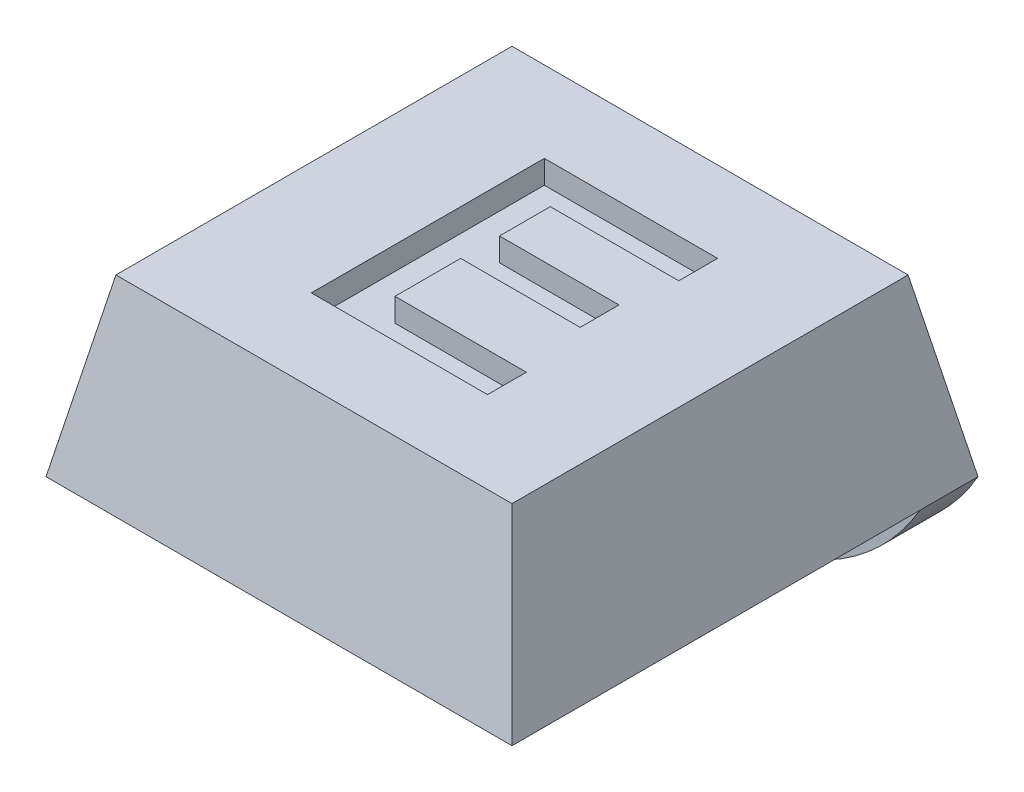
ISO-10303-21;
HEADER;
FILE_DESCRIPTION(('STEP AP214'),'2;1');
FILE_NAME('part.step','',(''),(''),'','','');
FILE_SCHEMA(('AUTOMOTIVE_DESIGN { 1 0 10303 214 1 1 1 1 }'));
ENDSEC;
DATA;
#1=APPLICATION_CONTEXT('core data for automotive mechanical design processes');
#2=APPLICATION_PROTOCOL_DEFINITION('international standard','automotive_design',2000,#1);
#3=PRODUCT_CONTEXT('',#1,'mechanical');
#4=PRODUCT('Part','Part','',(#3));
#5=PRODUCT_RELATED_PRODUCT_CATEGORY('part','',(#4));
#6=PRODUCT_DEFINITION_FORMATION('','',#4);
#7=PRODUCT_DEFINITION_CONTEXT('part definition',#1,'design');
#8=PRODUCT_DEFINITION('design','',#6,#7);
#9=PRODUCT_DEFINITION_SHAPE('','',#8);
#10=(LENGTH_UNIT() NAMED_UNIT(*) SI_UNIT(.MILLI.,.METRE.));
#11=(NAMED_UNIT(*) PLANE_ANGLE_UNIT() SI_UNIT($,.RADIAN.));
#12=(NAMED_UNIT(*) SI_UNIT($,.STERADIAN.) SOLID_ANGLE_UNIT());
#13=UNCERTAINTY_MEASURE_WITH_UNIT(LENGTH_MEASURE(1.E-05),#10,'distance_accuracy_value','');
#14=(GEOMETRIC_REPRESENTATION_CONTEXT(3) GLOBAL_UNCERTAINTY_ASSIGNED_CONTEXT((#13)) GLOBAL_UNIT_ASSIGNED_CONTEXT((#10,
#11,#12)) REPRESENTATION_CONTEXT('',''));
#15=CARTESIAN_POINT('',(0.,0.,0.));
#16=DIRECTION('',(0.,0.,1.));
#17=DIRECTION('',(1.,0.,0.));
#18=AXIS2_PLACEMENT_3D('',#15,#16,#17);
#19=CARTESIAN_POINT('',(0.,3.,0.));
#20=DIRECTION('',(0.,-1.,0.));
#21=DIRECTION('',(0.,0.,-1.));
#22=AXIS2_PLACEMENT_3D('',#19,#20,#21);
#23=PLANE('',#22);
#24=DIRECTION('',(-1.,0.,0.));
#25=VECTOR('',#24,1.);
#26=CARTESIAN_POINT('',(11.,3.,-0.6));
#27=LINE('',#26,#25);
#28=CARTESIAN_POINT('',(7.4,3.,-0.6));
#29=VERTEX_POINT('',#28);
#30=CARTESIAN_POINT('',(0.6,3.,-0.6));
#31=VERTEX_POINT('',#30);
#32=EDGE_CURVE('E229',#29,#31,#27,.T.);
#33=ORIENTED_EDGE('',*,*,#32,.F.);
#34=DIRECTION('',(0.,0.,1.));
#35=VECTOR('',#34,1.);
#36=CARTESIAN_POINT('',(7.4,3.,-8.));
#37=LINE('',#36,#35);
#38=CARTESIAN_POINT('',(7.4,3.,-7.4));
#39=VERTEX_POINT('',#38);
#40=EDGE_CURVE('E242',#39,#29,#37,.T.);
#41=ORIENTED_EDGE('',*,*,#40,.F.);
#42=DIRECTION('',(-1.,0.,0.));
#43=VECTOR('',#42,1.);
#44=CARTESIAN_POINT('',(11.,3.,-7.4));
#45=LINE('',#44,#43);
#46=CARTESIAN_POINT('',(0.599999999999999,3.,-7.4));
#47=VERTEX_POINT('',#46);
#48=EDGE_CURVE('E225',#39,#47,#45,.T.);
#49=ORIENTED_EDGE('',*,*,#48,.T.);
#50=DIRECTION('',(0.,0.,1.));
#51=VECTOR('',#50,1.);
#52=CARTESIAN_POINT('',(0.6,3.,-8.));
#53=LINE('',#52,#51);
#54=EDGE_CURVE('E245',#47,#31,#53,.T.);
#55=ORIENTED_EDGE('',*,*,#54,.T.);
#56=EDGE_LOOP('',(#33,#41,#49,#55));
#57=FACE_BOUND('',#56,.T.);
#58=DIRECTION('',(-1.,0.,0.));
#59=VECTOR('',#58,1.);
#60=CARTESIAN_POINT('',(5.56986613117245,3.,-2.0105672247147));
#61=LINE('',#60,#59);
#62=CARTESIAN_POINT('',(5.56986613117245,3.,-2.0105672247147));
#63=VERTEX_POINT('',#62);
#64=CARTESIAN_POINT('',(2.54422510553142,3.,-2.0105672247147));
#65=VERTEX_POINT('',#64);
#66=EDGE_CURVE('E58',#63,#65,#61,.T.);
#67=ORIENTED_EDGE('',*,*,#66,.T.);
#68=DIRECTION('',(0.,0.,-1.));
#69=VECTOR('',#68,1.);
#70=CARTESIAN_POINT('',(2.54422510553142,3.,-2.0105672247147));
#71=LINE('',#70,#69);
#72=CARTESIAN_POINT('',(2.54422510553142,3.,-6.0105672247147));
#73=VERTEX_POINT('',#72);
#74=EDGE_CURVE('E197',#65,#73,#71,.T.);
#75=ORIENTED_EDGE('',*,*,#74,.T.);
#76=DIRECTION('',(1.,0.,0.));
#77=VECTOR('',#76,1.);
#78=CARTESIAN_POINT('',(2.54422510553142,3.,-6.0105672247147));
#79=LINE('',#78,#77);
#80=CARTESIAN_POINT('',(5.5185840798904,3.,-6.0105672247147));
#81=VERTEX_POINT('',#80);
#82=EDGE_CURVE('E666',#73,#81,#79,.T.);
#83=ORIENTED_EDGE('',*,*,#82,.T.);
#84=DIRECTION('',(0.,0.,1.));
#85=VECTOR('',#84,1.);
#86=CARTESIAN_POINT('',(5.5185840798904,3.,-6.0105672247147));
#87=LINE('',#86,#85);
#88=CARTESIAN_POINT('',(5.5185840798904,3.,-5.34390055804804));
#89=VERTEX_POINT('',#88);
#90=EDGE_CURVE('E668',#81,#89,#87,.T.);
#91=ORIENTED_EDGE('',*,*,#90,.T.);
#92=DIRECTION('',(-1.,0.,0.));
#93=VECTOR('',#92,1.);
#94=CARTESIAN_POINT('',(5.5185840798904,3.,-5.34390055804804));
#95=LINE('',#94,#93);
#96=CARTESIAN_POINT('',(3.31345587476219,3.,-5.34390055804804));
#97=VERTEX_POINT('',#96);
#98=EDGE_CURVE('E673',#89,#97,#95,.T.);
#99=ORIENTED_EDGE('',*,*,#98,.T.);
#100=DIRECTION('',(0.,0.,1.));
#101=VECTOR('',#100,1.);
#102=CARTESIAN_POINT('',(3.31345587476219,3.,-5.34390055804804));
#103=LINE('',#102,#101);
#104=CARTESIAN_POINT('',(3.31345587476219,3.,-4.47210568625316));
#105=VERTEX_POINT('',#104);
#106=EDGE_CURVE('E683',#97,#105,#103,.T.);
#107=ORIENTED_EDGE('',*,*,#106,.T.);
#108=DIRECTION('',(1.,0.,0.));
#109=VECTOR('',#108,1.);
#110=CARTESIAN_POINT('',(3.31345587476219,3.,-4.47210568625316));
#111=LINE('',#110,#109);
#112=CARTESIAN_POINT('',(5.36473792604425,3.,-4.47210568625316));
#113=VERTEX_POINT('',#112);
#114=EDGE_CURVE('E687',#105,#113,#111,.T.);
#115=ORIENTED_EDGE('',*,*,#114,.T.);
#116=DIRECTION('',(0.,0.,1.));
#117=VECTOR('',#116,1.);
#118=CARTESIAN_POINT('',(5.36473792604425,3.,-4.47210568625316));
#119=LINE('',#118,#117);
#120=CARTESIAN_POINT('',(5.36473792604425,3.,-3.8054390195865));
#121=VERTEX_POINT('',#120);
#122=EDGE_CURVE('E691',#113,#121,#119,.T.);
#123=ORIENTED_EDGE('',*,*,#122,.T.);
#124=DIRECTION('',(-1.,0.,0.));
#125=VECTOR('',#124,1.);
#126=CARTESIAN_POINT('',(5.36473792604425,3.,-3.8054390195865));
#127=LINE('',#126,#125);
#128=CARTESIAN_POINT('',(3.31345587476219,3.,-3.8054390195865));
#129=VERTEX_POINT('',#128);
#130=EDGE_CURVE('E632',#121,#129,#127,.T.);
#131=ORIENTED_EDGE('',*,*,#130,.T.);
#132=DIRECTION('',(0.,0.,1.));
#133=VECTOR('',#132,1.);
#134=CARTESIAN_POINT('',(3.31345587476219,3.,-3.8054390195865));
#135=LINE('',#134,#133);
#136=CARTESIAN_POINT('',(3.31345587476219,3.,-2.67723389138137));
#137=VERTEX_POINT('',#136);
#138=EDGE_CURVE('E627',#129,#137,#135,.T.);
#139=ORIENTED_EDGE('',*,*,#138,.T.);
#140=DIRECTION('',(1.,0.,0.));
#141=VECTOR('',#140,1.);
#142=CARTESIAN_POINT('',(3.31345587476219,3.,-2.67723389138137));
#143=LINE('',#142,#141);
#144=CARTESIAN_POINT('',(5.56986613117245,3.,-2.67723389138137));
#145=VERTEX_POINT('',#144);
#146=EDGE_CURVE('E621',#137,#145,#143,.T.);
#147=ORIENTED_EDGE('',*,*,#146,.T.);
#148=DIRECTION('',(0.,0.,1.));
#149=VECTOR('',#148,1.);
#150=CARTESIAN_POINT('',(5.56986613117245,3.,-2.67723389138137));
#151=LINE('',#150,#149);
#152=EDGE_CURVE('E193',#145,#63,#151,.T.);
#153=ORIENTED_EDGE('',*,*,#152,.T.);
#154=EDGE_LOOP('',(#67,#75,#83,#91,#99,#107,#115,#123,#131,#139,#147,#153));
#155=FACE_BOUND('',#154,.T.);
#156=ADVANCED_FACE('F42',(#57,#155),#23,.F.);
#157=CARTESIAN_POINT('',(8.,0.,-8.));
#158=DIRECTION('',(-0.98058067569092,-0.196116135138184,0.));
#159=DIRECTION('',(0.196116135138184,-0.98058067569092,0.));
#160=AXIS2_PLACEMENT_3D('',#157,#158,#159);
#161=PLANE('',#160);
#162=DIRECTION('',(-0.192450089729875,0.962250448649376,-0.192450089729875));
#163=VECTOR('',#162,1.);
#164=CARTESIAN_POINT('',(7.7037037037037,1.48148148148148,-0.296296296296296));
#165=LINE('',#164,#163);
#166=CARTESIAN_POINT('',(8.,0.,0.));
#167=VERTEX_POINT('',#166);
#168=EDGE_CURVE('E239',#167,#29,#165,.T.);
#169=ORIENTED_EDGE('',*,*,#168,.F.);
#170=DIRECTION('',(0.,0.,-1.));
#171=VECTOR('',#170,1.);
#172=CARTESIAN_POINT('',(8.,0.,0.));
#173=LINE('',#172,#171);
#174=CARTESIAN_POINT('',(8.,0.,-7.));
#175=VERTEX_POINT('',#174);
#176=EDGE_CURVE('E258',#167,#175,#173,.T.);
#177=ORIENTED_EDGE('',*,*,#176,.T.);
#178=DIRECTION('',(0.,0.,1.));
#179=VECTOR('',#178,1.);
#180=CARTESIAN_POINT('',(8.,0.,-8.));
#181=LINE('',#180,#179);
#182=CARTESIAN_POINT('',(8.,0.,-8.));
#183=VERTEX_POINT('',#182);
#184=EDGE_CURVE('E199',#183,#175,#181,.T.);
#185=ORIENTED_EDGE('',*,*,#184,.F.);
#186=DIRECTION('',(0.192450089729875,-0.962250448649376,-0.192450089729875));
#187=VECTOR('',#186,1.);
#188=CARTESIAN_POINT('',(8.,0.,-8.));
#189=LINE('',#188,#187);
#190=EDGE_CURVE('E232',#39,#183,#189,.T.);
#191=ORIENTED_EDGE('',*,*,#190,.F.);
#192=ORIENTED_EDGE('',*,*,#40,.T.);
#193=EDGE_LOOP('',(#169,#177,#185,#191,#192));
#194=FACE_BOUND('',#193,.T.);
#195=ADVANCED_FACE('F326',(#194),#161,.F.);
#196=CARTESIAN_POINT('',(0.,0.,-8.));
#197=DIRECTION('',(0.98058067569092,-0.196116135138184,0.));
#198=DIRECTION('',(0.196116135138184,0.98058067569092,0.));
#199=AXIS2_PLACEMENT_3D('',#196,#197,#198);
#200=PLANE('',#199);
#201=DIRECTION('',(-0.192450089729875,-0.962250448649376,0.192450089729875));
#202=VECTOR('',#201,1.);
#203=CARTESIAN_POINT('',(0.296296296296296,1.48148148148148,-0.296296296296296));
#204=LINE('',#203,#202);
#205=CARTESIAN_POINT('',(0.,0.,0.));
#206=VERTEX_POINT('',#205);
#207=EDGE_CURVE('E286',#31,#206,#204,.T.);
#208=ORIENTED_EDGE('',*,*,#207,.F.);
#209=ORIENTED_EDGE('',*,*,#54,.F.);
#210=DIRECTION('',(0.192450089729875,0.962250448649376,0.192450089729875));
#211=VECTOR('',#210,1.);
#212=CARTESIAN_POINT('',(0.,0.,-8.));
#213=LINE('',#212,#211);
#214=CARTESIAN_POINT('',(0.,0.,-8.));
#215=VERTEX_POINT('',#214);
#216=EDGE_CURVE('E257',#215,#47,#213,.T.);
#217=ORIENTED_EDGE('',*,*,#216,.F.);
#218=DIRECTION('',(0.,0.,1.));
#219=VECTOR('',#218,1.);
#220=CARTESIAN_POINT('',(0.,0.,0.));
#221=LINE('',#220,#219);
#222=CARTESIAN_POINT('',(0.,0.,-7.));
#223=VERTEX_POINT('',#222);
#224=EDGE_CURVE('E262',#215,#223,#221,.T.);
#225=ORIENTED_EDGE('',*,*,#224,.T.);
#226=EDGE_CURVE('E249',#223,#206,#221,.T.);
#227=ORIENTED_EDGE('',*,*,#226,.T.);
#228=EDGE_LOOP('',(#208,#209,#217,#225,#227));
#229=FACE_BOUND('',#228,.T.);
#230=ADVANCED_FACE('F310',(#229),#200,.F.);
#231=CARTESIAN_POINT('',(0.,0.,0.));
#232=DIRECTION('',(0.,-1.,0.));
#233=DIRECTION('',(0.,0.,-1.));
#234=AXIS2_PLACEMENT_3D('',#231,#232,#233);
#235=PLANE('',#234);
#236=DIRECTION('',(-1.,0.,0.));
#237=VECTOR('',#236,1.);
#238=CARTESIAN_POINT('',(0.,0.,-7.));
#239=LINE('',#238,#237);
#240=EDGE_CURVE('E205',#175,#223,#239,.T.);
#241=ORIENTED_EDGE('',*,*,#240,.F.);
#242=ORIENTED_EDGE('',*,*,#176,.F.);
#243=DIRECTION('',(1.,0.,0.));
#244=VECTOR('',#243,1.);
#245=CARTESIAN_POINT('',(0.,0.,0.));
#246=LINE('',#245,#244);
#247=EDGE_CURVE('E259',#206,#167,#246,.T.);
#248=ORIENTED_EDGE('',*,*,#247,.F.);
#249=ORIENTED_EDGE('',*,*,#226,.F.);
#250=EDGE_LOOP('',(#241,#242,#248,#249));
#251=FACE_BOUND('',#250,.T.);
#252=CARTESIAN_POINT('',(4.,0.,-3.75));
#253=DIRECTION('',(0.,-1.,0.));
#254=DIRECTION('',(0.,0.,-1.));
#255=AXIS2_PLACEMENT_3D('',#252,#253,#254);
#256=CIRCLE('',#255,1.8);
#257=CARTESIAN_POINT('',(4.,0.,-5.55));
#258=VERTEX_POINT('',#257);
#259=EDGE_CURVE('E217',#258,#258,#256,.T.);
#260=ORIENTED_EDGE('',*,*,#259,.F.);
#261=EDGE_LOOP('',(#260));
#262=FACE_BOUND('',#261,.T.);
#263=ADVANCED_FACE('F321',(#251,#262),#235,.T.);
#264=CARTESIAN_POINT('',(11.,3.,-7.4));
#265=DIRECTION('',(0.,0.196116135138184,-0.98058067569092));
#266=DIRECTION('',(0.,0.98058067569092,0.196116135138184));
#267=AXIS2_PLACEMENT_3D('',#264,#265,#266);
#268=PLANE('',#267);
#269=ORIENTED_EDGE('',*,*,#190,.T.);
#270=DIRECTION('',(-1.,0.,0.));
#271=VECTOR('',#270,1.);
#272=CARTESIAN_POINT('',(0.,0.,-8.));
#273=LINE('',#272,#271);
#274=EDGE_CURVE('E253',#183,#215,#273,.T.);
#275=ORIENTED_EDGE('',*,*,#274,.T.);
#276=ORIENTED_EDGE('',*,*,#216,.T.);
#277=ORIENTED_EDGE('',*,*,#48,.F.);
#278=EDGE_LOOP('',(#269,#275,#276,#277));
#279=FACE_BOUND('',#278,.T.);
#280=ADVANCED_FACE('F305',(#279),#268,.T.);
#281=CARTESIAN_POINT('',(11.,0.,0.));
#282=DIRECTION('',(0.,0.196116135138184,0.98058067569092));
#283=DIRECTION('',(0.,-0.98058067569092,0.196116135138184));
#284=AXIS2_PLACEMENT_3D('',#281,#282,#283);
#285=PLANE('',#284);
#286=ORIENTED_EDGE('',*,*,#168,.T.);
#287=ORIENTED_EDGE('',*,*,#32,.T.);
#288=ORIENTED_EDGE('',*,*,#207,.T.);
#289=ORIENTED_EDGE('',*,*,#247,.T.);
#290=EDGE_LOOP('',(#286,#287,#288,#289));
#291=FACE_BOUND('',#290,.T.);
#292=ADVANCED_FACE('F352',(#291),#285,.T.);
#293=CARTESIAN_POINT('',(4.,0.8,-3.75));
#294=DIRECTION('',(0.,-1.,0.));
#295=DIRECTION('',(0.,0.,-1.));
#296=AXIS2_PLACEMENT_3D('',#293,#294,#295);
#297=CYLINDRICAL_SURFACE('',#296,1.8);
#298=CARTESIAN_POINT('',(4.,0.8,-3.75));
#299=DIRECTION('',(0.,-1.,0.));
#300=DIRECTION('',(0.,0.,-1.));
#301=AXIS2_PLACEMENT_3D('',#298,#299,#300);
#302=CIRCLE('',#301,1.8);
#303=CARTESIAN_POINT('',(4.,0.8,-5.55));
#304=VERTEX_POINT('',#303);
#305=EDGE_CURVE('E221',#304,#304,#302,.T.);
#306=ORIENTED_EDGE('',*,*,#305,.F.);
#307=EDGE_LOOP('',(#306));
#308=FACE_BOUND('',#307,.T.);
#309=ORIENTED_EDGE('',*,*,#259,.T.);
#310=EDGE_LOOP('',(#309));
#311=FACE_BOUND('',#310,.T.);
#312=ADVANCED_FACE('F359',(#308,#311),#297,.F.);
#313=CARTESIAN_POINT('',(4.,0.8,-3.75));
#314=DIRECTION('',(0.,-1.,0.));
#315=DIRECTION('',(0.,0.,-1.));
#316=AXIS2_PLACEMENT_3D('',#313,#314,#315);
#317=PLANE('',#316);
#318=ORIENTED_EDGE('',*,*,#305,.T.);
#319=EDGE_LOOP('',(#318));
#320=FACE_BOUND('',#319,.T.);
#321=ADVANCED_FACE('F363',(#320),#317,.T.);
#322=CARTESIAN_POINT('',(0.,-2.,-8.));
#323=DIRECTION('',(0.,0.,1.));
#324=DIRECTION('',(1.,0.,0.));
#325=AXIS2_PLACEMENT_3D('',#322,#323,#324);
#326=PLANE('',#325);
#327=ORIENTED_EDGE('',*,*,#274,.F.);
#328=CARTESIAN_POINT('',(4.53589838486225,2.,-8.));
#329=DIRECTION('',(0.,0.,1.));
#330=DIRECTION('',(1.,0.,0.));
#331=AXIS2_PLACEMENT_3D('',#328,#329,#330);
#332=CIRCLE('',#331,4.);
#333=CARTESIAN_POINT('',(4.53589838486225,-2.,-8.));
#334=VERTEX_POINT('',#333);
#335=EDGE_CURVE('E11',#183,#334,#332,.F.);
#336=ORIENTED_EDGE('',*,*,#335,.T.);
#337=DIRECTION('',(1.,0.,0.));
#338=VECTOR('',#337,1.);
#339=CARTESIAN_POINT('',(0.,-2.,-8.));
#340=LINE('',#339,#338);
#341=CARTESIAN_POINT('',(3.46410161513775,-2.,-8.));
#342=VERTEX_POINT('',#341);
#343=EDGE_CURVE('E211',#342,#334,#340,.T.);
#344=ORIENTED_EDGE('',*,*,#343,.F.);
#345=CARTESIAN_POINT('',(3.46410161513775,2.,-8.));
#346=DIRECTION('',(0.,0.,1.));
#347=DIRECTION('',(1.,0.,0.));
#348=AXIS2_PLACEMENT_3D('',#345,#346,#347);
#349=CIRCLE('',#348,4.);
#350=EDGE_CURVE('E51',#342,#215,#349,.F.);
#351=ORIENTED_EDGE('',*,*,#350,.T.);
#352=EDGE_LOOP('',(#327,#336,#344,#351));
#353=FACE_BOUND('',#352,.T.);
#354=ADVANCED_FACE('F298',(#353),#326,.F.);
#355=CARTESIAN_POINT('',(0.,-2.,-7.));
#356=DIRECTION('',(0.,0.,-1.));
#357=DIRECTION('',(-1.,0.,0.));
#358=AXIS2_PLACEMENT_3D('',#355,#356,#357);
#359=PLANE('',#358);
#360=DIRECTION('',(-1.,0.,0.));
#361=VECTOR('',#360,1.);
#362=CARTESIAN_POINT('',(0.,-2.,-7.));
#363=LINE('',#362,#361);
#364=CARTESIAN_POINT('',(4.53589838486225,-2.,-7.));
#365=VERTEX_POINT('',#364);
#366=CARTESIAN_POINT('',(3.46410161513775,-2.,-7.));
#367=VERTEX_POINT('',#366);
#368=EDGE_CURVE('E215',#365,#367,#363,.T.);
#369=ORIENTED_EDGE('',*,*,#368,.F.);
#370=CARTESIAN_POINT('',(4.53589838486225,2.,-7.));
#371=DIRECTION('',(0.,0.,-1.));
#372=DIRECTION('',(-1.,0.,0.));
#373=AXIS2_PLACEMENT_3D('',#370,#371,#372);
#374=CIRCLE('',#373,4.);
#375=EDGE_CURVE('E292',#365,#175,#374,.F.);
#376=ORIENTED_EDGE('',*,*,#375,.T.);
#377=ORIENTED_EDGE('',*,*,#240,.T.);
#378=CARTESIAN_POINT('',(3.46410161513775,2.,-7.));
#379=DIRECTION('',(0.,0.,-1.));
#380=DIRECTION('',(-1.,0.,0.));
#381=AXIS2_PLACEMENT_3D('',#378,#379,#380);
#382=CIRCLE('',#381,4.);
#383=EDGE_CURVE('E66',#223,#367,#382,.F.);
#384=ORIENTED_EDGE('',*,*,#383,.T.);
#385=EDGE_LOOP('',(#369,#376,#377,#384));
#386=FACE_BOUND('',#385,.T.);
#387=ADVANCED_FACE('F316',(#386),#359,.F.);
#388=CARTESIAN_POINT('',(0.,-2.,0.));
#389=DIRECTION('',(0.,1.,0.));
#390=DIRECTION('',(0.,0.,1.));
#391=AXIS2_PLACEMENT_3D('',#388,#389,#390);
#392=PLANE('',#391);
#393=ORIENTED_EDGE('',*,*,#343,.T.);
#394=DIRECTION('',(0.,0.,1.));
#395=VECTOR('',#394,1.);
#396=CARTESIAN_POINT('',(4.53589838486225,-2.,0.));
#397=LINE('',#396,#395);
#398=EDGE_CURVE('E285',#334,#365,#397,.T.);
#399=ORIENTED_EDGE('',*,*,#398,.T.);
#400=ORIENTED_EDGE('',*,*,#368,.T.);
#401=DIRECTION('',(0.,0.,-1.));
#402=VECTOR('',#401,1.);
#403=CARTESIAN_POINT('',(3.46410161513775,-2.,0.));
#404=LINE('',#403,#402);
#405=EDGE_CURVE('E281',#367,#342,#404,.T.);
#406=ORIENTED_EDGE('',*,*,#405,.T.);
#407=EDGE_LOOP('',(#393,#399,#400,#406));
#408=FACE_BOUND('',#407,.T.);
#409=ADVANCED_FACE('F314',(#408),#392,.F.);
#410=CARTESIAN_POINT('',(4.53589838486225,2.,-8.));
#411=DIRECTION('',(0.,0.,1.));
#412=DIRECTION('',(1.,0.,0.));
#413=AXIS2_PLACEMENT_3D('',#410,#411,#412);
#414=CYLINDRICAL_SURFACE('',#413,4.);
#415=ORIENTED_EDGE('',*,*,#335,.F.);
#416=ORIENTED_EDGE('',*,*,#184,.T.);
#417=ORIENTED_EDGE('',*,*,#375,.F.);
#418=ORIENTED_EDGE('',*,*,#398,.F.);
#419=EDGE_LOOP('',(#415,#416,#417,#418));
#420=FACE_BOUND('',#419,.T.);
#421=ADVANCED_FACE('F327',(#420),#414,.T.);
#422=CARTESIAN_POINT('',(3.46410161513775,2.,-8.));
#423=DIRECTION('',(0.,0.,-1.));
#424=DIRECTION('',(-1.,0.,0.));
#425=AXIS2_PLACEMENT_3D('',#422,#423,#424);
#426=CYLINDRICAL_SURFACE('',#425,4.);
#427=ORIENTED_EDGE('',*,*,#383,.F.);
#428=ORIENTED_EDGE('',*,*,#224,.F.);
#429=ORIENTED_EDGE('',*,*,#350,.F.);
#430=ORIENTED_EDGE('',*,*,#405,.F.);
#431=EDGE_LOOP('',(#427,#428,#429,#430));
#432=FACE_BOUND('',#431,.T.);
#433=ADVANCED_FACE('F44',(#432),#426,.T.);
#434=CARTESIAN_POINT('',(5.56986613117245,2.6,-2.0105672247147));
#435=DIRECTION('',(0.,0.,-1.));
#436=DIRECTION('',(-1.,0.,0.));
#437=AXIS2_PLACEMENT_3D('',#434,#435,#436);
#438=PLANE('',#437);
#439=ORIENTED_EDGE('',*,*,#66,.F.);
#440=DIRECTION('',(0.,1.,0.));
#441=VECTOR('',#440,1.);
#442=CARTESIAN_POINT('',(5.56986613117245,2.6,-2.0105672247147));
#443=LINE('',#442,#441);
#444=CARTESIAN_POINT('',(5.56986613117245,2.6,-2.0105672247147));
#445=VERTEX_POINT('',#444);
#446=EDGE_CURVE('E191',#445,#63,#443,.T.);
#447=ORIENTED_EDGE('',*,*,#446,.F.);
#448=DIRECTION('',(-1.,0.,0.));
#449=VECTOR('',#448,1.);
#450=CARTESIAN_POINT('',(5.56986613117245,2.6,-2.0105672247147));
#451=LINE('',#450,#449);
#452=CARTESIAN_POINT('',(2.54422510553142,2.6,-2.0105672247147));
#453=VERTEX_POINT('',#452);
#454=EDGE_CURVE('E181',#445,#453,#451,.T.);
#455=ORIENTED_EDGE('',*,*,#454,.T.);
#456=DIRECTION('',(0.,1.,0.));
#457=VECTOR('',#456,1.);
#458=CARTESIAN_POINT('',(2.54422510553142,2.6,-2.0105672247147));
#459=LINE('',#458,#457);
#460=EDGE_CURVE('E190',#453,#65,#459,.T.);
#461=ORIENTED_EDGE('',*,*,#460,.T.);
#462=EDGE_LOOP('',(#439,#447,#455,#461));
#463=FACE_BOUND('',#462,.T.);
#464=ADVANCED_FACE('F189',(#463),#438,.T.);
#465=CARTESIAN_POINT('',(2.54422510553142,2.6,-2.0105672247147));
#466=DIRECTION('',(1.,0.,0.));
#467=DIRECTION('',(0.,0.,-1.));
#468=AXIS2_PLACEMENT_3D('',#465,#466,#467);
#469=PLANE('',#468);
#470=ORIENTED_EDGE('',*,*,#74,.F.);
#471=ORIENTED_EDGE('',*,*,#460,.F.);
#472=DIRECTION('',(0.,0.,-1.));
#473=VECTOR('',#472,1.);
#474=CARTESIAN_POINT('',(2.54422510553142,2.6,-2.0105672247147));
#475=LINE('',#474,#473);
#476=CARTESIAN_POINT('',(2.54422510553142,2.6,-6.0105672247147));
#477=VERTEX_POINT('',#476);
#478=EDGE_CURVE('E177',#453,#477,#475,.T.);
#479=ORIENTED_EDGE('',*,*,#478,.T.);
#480=DIRECTION('',(0.,1.,0.));
#481=VECTOR('',#480,1.);
#482=CARTESIAN_POINT('',(2.54422510553142,2.6,-6.0105672247147));
#483=LINE('',#482,#481);
#484=EDGE_CURVE('E200',#477,#73,#483,.T.);
#485=ORIENTED_EDGE('',*,*,#484,.T.);
#486=EDGE_LOOP('',(#470,#471,#479,#485));
#487=FACE_BOUND('',#486,.T.);
#488=ADVANCED_FACE('F195',(#487),#469,.T.);
#489=CARTESIAN_POINT('',(2.54422510553142,2.6,-6.0105672247147));
#490=DIRECTION('',(0.,0.,1.));
#491=DIRECTION('',(1.,0.,0.));
#492=AXIS2_PLACEMENT_3D('',#489,#490,#491);
#493=PLANE('',#492);
#494=ORIENTED_EDGE('',*,*,#82,.F.);
#495=ORIENTED_EDGE('',*,*,#484,.F.);
#496=DIRECTION('',(1.,0.,0.));
#497=VECTOR('',#496,1.);
#498=CARTESIAN_POINT('',(2.54422510553142,2.6,-6.0105672247147));
#499=LINE('',#498,#497);
#500=CARTESIAN_POINT('',(5.5185840798904,2.6,-6.0105672247147));
#501=VERTEX_POINT('',#500);
#502=EDGE_CURVE('E183',#477,#501,#499,.T.);
#503=ORIENTED_EDGE('',*,*,#502,.T.);
#504=DIRECTION('',(0.,1.,0.));
#505=VECTOR('',#504,1.);
#506=CARTESIAN_POINT('',(5.5185840798904,2.6,-6.0105672247147));
#507=LINE('',#506,#505);
#508=EDGE_CURVE('E207',#501,#81,#507,.T.);
#509=ORIENTED_EDGE('',*,*,#508,.T.);
#510=EDGE_LOOP('',(#494,#495,#503,#509));
#511=FACE_BOUND('',#510,.T.);
#512=ADVANCED_FACE('F376',(#511),#493,.T.);
#513=CARTESIAN_POINT('',(5.5185840798904,2.6,-6.0105672247147));
#514=DIRECTION('',(-1.,0.,0.));
#515=DIRECTION('',(0.,0.,1.));
#516=AXIS2_PLACEMENT_3D('',#513,#514,#515);
#517=PLANE('',#516);
#518=ORIENTED_EDGE('',*,*,#90,.F.);
#519=ORIENTED_EDGE('',*,*,#508,.F.);
#520=DIRECTION('',(0.,0.,1.));
#521=VECTOR('',#520,1.);
#522=CARTESIAN_POINT('',(5.5185840798904,2.6,-6.0105672247147));
#523=LINE('',#522,#521);
#524=CARTESIAN_POINT('',(5.5185840798904,2.6,-5.34390055804804));
#525=VERTEX_POINT('',#524);
#526=EDGE_CURVE('E727',#501,#525,#523,.T.);
#527=ORIENTED_EDGE('',*,*,#526,.T.);
#528=DIRECTION('',(0.,1.,0.));
#529=VECTOR('',#528,1.);
#530=CARTESIAN_POINT('',(5.5185840798904,2.6,-5.34390055804804));
#531=LINE('',#530,#529);
#532=EDGE_CURVE('E659',#525,#89,#531,.T.);
#533=ORIENTED_EDGE('',*,*,#532,.T.);
#534=EDGE_LOOP('',(#518,#519,#527,#533));
#535=FACE_BOUND('',#534,.T.);
#536=ADVANCED_FACE('F379',(#535),#517,.T.);
#537=CARTESIAN_POINT('',(5.5185840798904,2.6,-5.34390055804804));
#538=DIRECTION('',(0.,0.,-1.));
#539=DIRECTION('',(-1.,0.,0.));
#540=AXIS2_PLACEMENT_3D('',#537,#538,#539);
#541=PLANE('',#540);
#542=ORIENTED_EDGE('',*,*,#98,.F.);
#543=ORIENTED_EDGE('',*,*,#532,.F.);
#544=DIRECTION('',(-1.,0.,0.));
#545=VECTOR('',#544,1.);
#546=CARTESIAN_POINT('',(5.5185840798904,2.6,-5.34390055804804));
#547=LINE('',#546,#545);
#548=CARTESIAN_POINT('',(3.31345587476219,2.6,-5.34390055804804));
#549=VERTEX_POINT('',#548);
#550=EDGE_CURVE('E724',#525,#549,#547,.T.);
#551=ORIENTED_EDGE('',*,*,#550,.T.);
#552=DIRECTION('',(0.,1.,0.));
#553=VECTOR('',#552,1.);
#554=CARTESIAN_POINT('',(3.31345587476219,2.6,-5.34390055804804));
#555=LINE('',#554,#553);
#556=EDGE_CURVE('E656',#549,#97,#555,.T.);
#557=ORIENTED_EDGE('',*,*,#556,.T.);
#558=EDGE_LOOP('',(#542,#543,#551,#557));
#559=FACE_BOUND('',#558,.T.);
#560=ADVANCED_FACE('F383',(#559),#541,.T.);
#561=CARTESIAN_POINT('',(3.31345587476219,2.6,-5.34390055804804));
#562=DIRECTION('',(-1.,0.,0.));
#563=DIRECTION('',(0.,0.,1.));
#564=AXIS2_PLACEMENT_3D('',#561,#562,#563);
#565=PLANE('',#564);
#566=ORIENTED_EDGE('',*,*,#106,.F.);
#567=ORIENTED_EDGE('',*,*,#556,.F.);
#568=DIRECTION('',(0.,0.,1.));
#569=VECTOR('',#568,1.);
#570=CARTESIAN_POINT('',(3.31345587476219,2.6,-5.34390055804804));
#571=LINE('',#570,#569);
#572=CARTESIAN_POINT('',(3.31345587476219,2.6,-4.47210568625316));
#573=VERTEX_POINT('',#572);
#574=EDGE_CURVE('E721',#549,#573,#571,.T.);
#575=ORIENTED_EDGE('',*,*,#574,.T.);
#576=DIRECTION('',(0.,1.,0.));
#577=VECTOR('',#576,1.);
#578=CARTESIAN_POINT('',(3.31345587476219,2.6,-4.47210568625316));
#579=LINE('',#578,#577);
#580=EDGE_CURVE('E653',#573,#105,#579,.T.);
#581=ORIENTED_EDGE('',*,*,#580,.T.);
#582=EDGE_LOOP('',(#566,#567,#575,#581));
#583=FACE_BOUND('',#582,.T.);
#584=ADVANCED_FACE('F387',(#583),#565,.T.);
#585=CARTESIAN_POINT('',(3.31345587476219,2.6,-4.47210568625316));
#586=DIRECTION('',(0.,0.,1.));
#587=DIRECTION('',(1.,0.,0.));
#588=AXIS2_PLACEMENT_3D('',#585,#586,#587);
#589=PLANE('',#588);
#590=ORIENTED_EDGE('',*,*,#114,.F.);
#591=ORIENTED_EDGE('',*,*,#580,.F.);
#592=DIRECTION('',(1.,0.,0.));
#593=VECTOR('',#592,1.);
#594=CARTESIAN_POINT('',(3.31345587476219,2.6,-4.47210568625316));
#595=LINE('',#594,#593);
#596=CARTESIAN_POINT('',(5.36473792604425,2.6,-4.47210568625316));
#597=VERTEX_POINT('',#596);
#598=EDGE_CURVE('E718',#573,#597,#595,.T.);
#599=ORIENTED_EDGE('',*,*,#598,.T.);
#600=DIRECTION('',(0.,1.,0.));
#601=VECTOR('',#600,1.);
#602=CARTESIAN_POINT('',(5.36473792604425,2.6,-4.47210568625316));
#603=LINE('',#602,#601);
#604=EDGE_CURVE('E650',#597,#113,#603,.T.);
#605=ORIENTED_EDGE('',*,*,#604,.T.);
#606=EDGE_LOOP('',(#590,#591,#599,#605));
#607=FACE_BOUND('',#606,.T.);
#608=ADVANCED_FACE('F391',(#607),#589,.T.);
#609=CARTESIAN_POINT('',(5.36473792604425,2.6,-4.47210568625316));
#610=DIRECTION('',(-1.,0.,0.));
#611=DIRECTION('',(0.,0.,1.));
#612=AXIS2_PLACEMENT_3D('',#609,#610,#611);
#613=PLANE('',#612);
#614=ORIENTED_EDGE('',*,*,#122,.F.);
#615=ORIENTED_EDGE('',*,*,#604,.F.);
#616=DIRECTION('',(0.,0.,1.));
#617=VECTOR('',#616,1.);
#618=CARTESIAN_POINT('',(5.36473792604425,2.6,-4.47210568625316));
#619=LINE('',#618,#617);
#620=CARTESIAN_POINT('',(5.36473792604425,2.6,-3.8054390195865));
#621=VERTEX_POINT('',#620);
#622=EDGE_CURVE('E715',#597,#621,#619,.T.);
#623=ORIENTED_EDGE('',*,*,#622,.T.);
#624=DIRECTION('',(0.,1.,0.));
#625=VECTOR('',#624,1.);
#626=CARTESIAN_POINT('',(5.36473792604425,2.6,-3.8054390195865));
#627=LINE('',#626,#625);
#628=EDGE_CURVE('E647',#621,#121,#627,.T.);
#629=ORIENTED_EDGE('',*,*,#628,.T.);
#630=EDGE_LOOP('',(#614,#615,#623,#629));
#631=FACE_BOUND('',#630,.T.);
#632=ADVANCED_FACE('F395',(#631),#613,.T.);
#633=CARTESIAN_POINT('',(5.36473792604425,2.6,-3.8054390195865));
#634=DIRECTION('',(0.,0.,-1.));
#635=DIRECTION('',(-1.,0.,0.));
#636=AXIS2_PLACEMENT_3D('',#633,#634,#635);
#637=PLANE('',#636);
#638=ORIENTED_EDGE('',*,*,#130,.F.);
#639=ORIENTED_EDGE('',*,*,#628,.F.);
#640=DIRECTION('',(-1.,0.,0.));
#641=VECTOR('',#640,1.);
#642=CARTESIAN_POINT('',(5.36473792604425,2.6,-3.8054390195865));
#643=LINE('',#642,#641);
#644=CARTESIAN_POINT('',(3.31345587476219,2.6,-3.8054390195865));
#645=VERTEX_POINT('',#644);
#646=EDGE_CURVE('E700',#621,#645,#643,.T.);
#647=ORIENTED_EDGE('',*,*,#646,.T.);
#648=DIRECTION('',(0.,1.,0.));
#649=VECTOR('',#648,1.);
#650=CARTESIAN_POINT('',(3.31345587476219,2.6,-3.8054390195865));
#651=LINE('',#650,#649);
#652=EDGE_CURVE('E644',#645,#129,#651,.T.);
#653=ORIENTED_EDGE('',*,*,#652,.T.);
#654=EDGE_LOOP('',(#638,#639,#647,#653));
#655=FACE_BOUND('',#654,.T.);
#656=ADVANCED_FACE('F399',(#655),#637,.T.);
#657=CARTESIAN_POINT('',(3.31345587476219,2.6,-3.8054390195865));
#658=DIRECTION('',(-1.,0.,0.));
#659=DIRECTION('',(0.,0.,1.));
#660=AXIS2_PLACEMENT_3D('',#657,#658,#659);
#661=PLANE('',#660);
#662=ORIENTED_EDGE('',*,*,#138,.F.);
#663=ORIENTED_EDGE('',*,*,#652,.F.);
#664=DIRECTION('',(0.,0.,1.));
#665=VECTOR('',#664,1.);
#666=CARTESIAN_POINT('',(3.31345587476219,2.6,-3.8054390195865));
#667=LINE('',#666,#665);
#668=CARTESIAN_POINT('',(3.31345587476219,2.6,-2.67723389138137));
#669=VERTEX_POINT('',#668);
#670=EDGE_CURVE('E702',#645,#669,#667,.T.);
#671=ORIENTED_EDGE('',*,*,#670,.T.);
#672=DIRECTION('',(0.,1.,0.));
#673=VECTOR('',#672,1.);
#674=CARTESIAN_POINT('',(3.31345587476219,2.6,-2.67723389138137));
#675=LINE('',#674,#673);
#676=EDGE_CURVE('E641',#669,#137,#675,.T.);
#677=ORIENTED_EDGE('',*,*,#676,.T.);
#678=EDGE_LOOP('',(#662,#663,#671,#677));
#679=FACE_BOUND('',#678,.T.);
#680=ADVANCED_FACE('F403',(#679),#661,.T.);
#681=CARTESIAN_POINT('',(3.31345587476219,2.6,-2.67723389138137));
#682=DIRECTION('',(0.,0.,1.));
#683=DIRECTION('',(1.,0.,0.));
#684=AXIS2_PLACEMENT_3D('',#681,#682,#683);
#685=PLANE('',#684);
#686=ORIENTED_EDGE('',*,*,#146,.F.);
#687=ORIENTED_EDGE('',*,*,#676,.F.);
#688=DIRECTION('',(1.,0.,0.));
#689=VECTOR('',#688,1.);
#690=CARTESIAN_POINT('',(3.31345587476219,2.6,-2.67723389138137));
#691=LINE('',#690,#689);
#692=CARTESIAN_POINT('',(5.56986613117245,2.6,-2.67723389138137));
#693=VERTEX_POINT('',#692);
#694=EDGE_CURVE('E704',#669,#693,#691,.T.);
#695=ORIENTED_EDGE('',*,*,#694,.T.);
#696=DIRECTION('',(0.,1.,0.));
#697=VECTOR('',#696,1.);
#698=CARTESIAN_POINT('',(5.56986613117245,2.6,-2.67723389138137));
#699=LINE('',#698,#697);
#700=EDGE_CURVE('E619',#693,#145,#699,.T.);
#701=ORIENTED_EDGE('',*,*,#700,.T.);
#702=EDGE_LOOP('',(#686,#687,#695,#701));
#703=FACE_BOUND('',#702,.T.);
#704=ADVANCED_FACE('F407',(#703),#685,.T.);
#705=CARTESIAN_POINT('',(5.56986613117245,2.6,-2.67723389138137));
#706=DIRECTION('',(-1.,0.,0.));
#707=DIRECTION('',(0.,0.,1.));
#708=AXIS2_PLACEMENT_3D('',#705,#706,#707);
#709=PLANE('',#708);
#710=ORIENTED_EDGE('',*,*,#152,.F.);
#711=ORIENTED_EDGE('',*,*,#700,.F.);
#712=DIRECTION('',(0.,0.,1.));
#713=VECTOR('',#712,1.);
#714=CARTESIAN_POINT('',(5.56986613117245,2.6,-2.67723389138137));
#715=LINE('',#714,#713);
#716=EDGE_CURVE('E638',#693,#445,#715,.T.);
#717=ORIENTED_EDGE('',*,*,#716,.T.);
#718=ORIENTED_EDGE('',*,*,#446,.T.);
#719=EDGE_LOOP('',(#710,#711,#717,#718));
#720=FACE_BOUND('',#719,.T.);
#721=ADVANCED_FACE('F411',(#720),#709,.T.);
#722=CARTESIAN_POINT('',(0.,2.6,0.));
#723=DIRECTION('',(0.,-1.,0.));
#724=DIRECTION('',(0.,0.,-1.));
#725=AXIS2_PLACEMENT_3D('',#722,#723,#724);
#726=PLANE('',#725);
#727=ORIENTED_EDGE('',*,*,#454,.F.);
#728=ORIENTED_EDGE('',*,*,#716,.F.);
#729=ORIENTED_EDGE('',*,*,#694,.F.);
#730=ORIENTED_EDGE('',*,*,#670,.F.);
#731=ORIENTED_EDGE('',*,*,#646,.F.);
#732=ORIENTED_EDGE('',*,*,#622,.F.);
#733=ORIENTED_EDGE('',*,*,#598,.F.);
#734=ORIENTED_EDGE('',*,*,#574,.F.);
#735=ORIENTED_EDGE('',*,*,#550,.F.);
#736=ORIENTED_EDGE('',*,*,#526,.F.);
#737=ORIENTED_EDGE('',*,*,#502,.F.);
#738=ORIENTED_EDGE('',*,*,#478,.F.);
#739=EDGE_LOOP('',(#727,#728,#729,#730,#731,#732,#733,#734,#735,#736,#737,#738));
#740=FACE_BOUND('',#739,.T.);
#741=ADVANCED_FACE('F179',(#740),#726,.F.);
#742=CLOSED_SHELL('',(#156,#195,#230,#263,#280,#292,#312,#321,#354,#387,#409,#421,#433,#464,
#488,#512,#536,#560,#584,#608,#632,#656,#680,#704,#721,#741));
#743=MANIFOLD_SOLID_BREP('B2',#742);
#744=ADVANCED_BREP_SHAPE_REPRESENTATION('',(#18,#743),#14);
#745=SHAPE_DEFINITION_REPRESENTATION(#9,#744);
ENDSEC;
END-ISO-10303-21;
